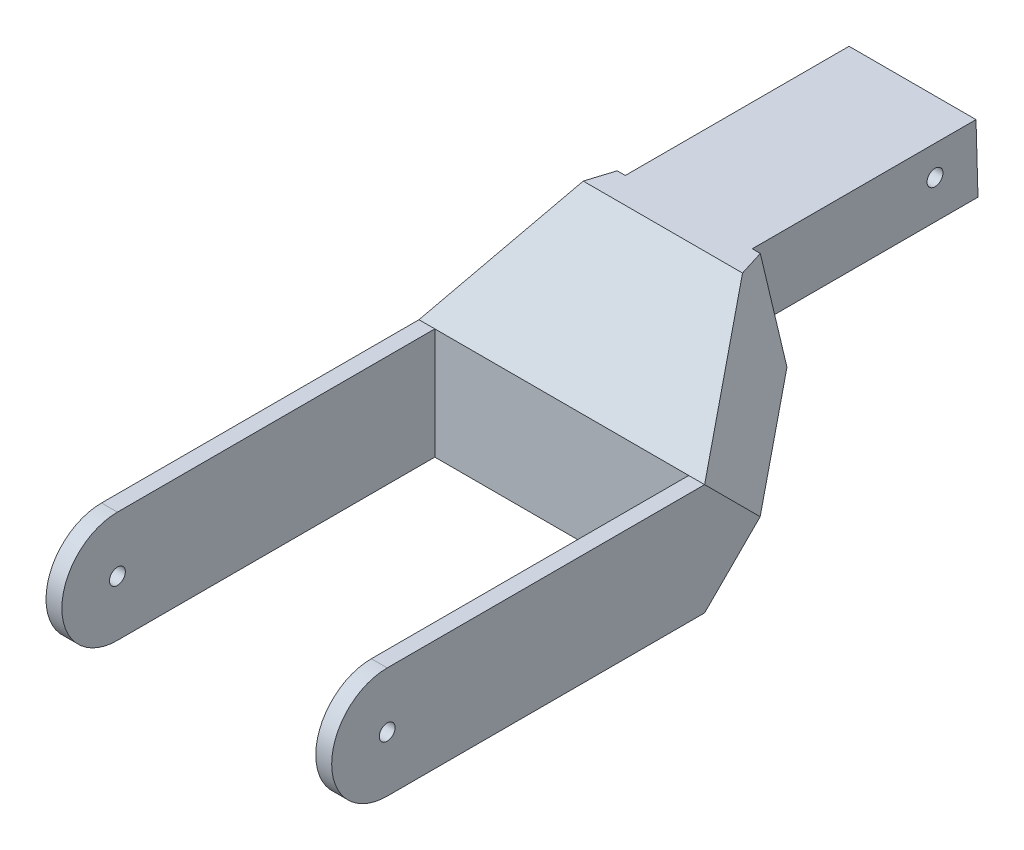
ISO-10303-21;
HEADER;
FILE_DESCRIPTION(('STEP AP214'),'2;1');
FILE_NAME('part.step','',(''),(''),'','','');
FILE_SCHEMA(('AUTOMOTIVE_DESIGN { 1 0 10303 214 1 1 1 1 }'));
ENDSEC;
DATA;
#1=APPLICATION_CONTEXT('core data for automotive mechanical design processes');
#2=APPLICATION_PROTOCOL_DEFINITION('international standard','automotive_design',2000,#1);
#3=PRODUCT_CONTEXT('',#1,'mechanical');
#4=PRODUCT('Part','Part','',(#3));
#5=PRODUCT_RELATED_PRODUCT_CATEGORY('part','',(#4));
#6=PRODUCT_DEFINITION_FORMATION('','',#4);
#7=PRODUCT_DEFINITION_CONTEXT('part definition',#1,'design');
#8=PRODUCT_DEFINITION('design','',#6,#7);
#9=PRODUCT_DEFINITION_SHAPE('','',#8);
#10=(LENGTH_UNIT() NAMED_UNIT(*) SI_UNIT(.MILLI.,.METRE.));
#11=(NAMED_UNIT(*) PLANE_ANGLE_UNIT() SI_UNIT($,.RADIAN.));
#12=(NAMED_UNIT(*) SI_UNIT($,.STERADIAN.) SOLID_ANGLE_UNIT());
#13=UNCERTAINTY_MEASURE_WITH_UNIT(LENGTH_MEASURE(1.E-05),#10,'distance_accuracy_value','');
#14=(GEOMETRIC_REPRESENTATION_CONTEXT(3) GLOBAL_UNCERTAINTY_ASSIGNED_CONTEXT((#13)) GLOBAL_UNIT_ASSIGNED_CONTEXT((#10,
#11,#12)) REPRESENTATION_CONTEXT('',''));
#15=CARTESIAN_POINT('',(0.,0.,0.));
#16=DIRECTION('',(0.,0.,1.));
#17=DIRECTION('',(1.,0.,0.));
#18=AXIS2_PLACEMENT_3D('',#15,#16,#17);
#19=CARTESIAN_POINT('',(9.40909090909091,-14.138051777226,-1.38690316592472));
#20=DIRECTION('',(-1.,0.,0.));
#21=DIRECTION('',(0.,0.,1.));
#22=AXIS2_PLACEMENT_3D('',#19,#20,#21);
#23=PLANE('',#22);
#24=CARTESIAN_POINT('',(9.40909090909091,3.65819158697021,-15.5225961633245));
#25=DIRECTION('',(1.,0.,0.));
#26=DIRECTION('',(0.,0.,-1.));
#27=AXIS2_PLACEMENT_3D('',#24,#25,#26);
#28=CIRCLE('',#27,0.615000000000002);
#29=CARTESIAN_POINT('',(9.40909090909091,3.65819158697021,-16.1375961633245));
#30=VERTEX_POINT('',#29);
#31=EDGE_CURVE('E162',#30,#30,#28,.T.);
#32=ORIENTED_EDGE('',*,*,#31,.F.);
#33=EDGE_LOOP('',(#32));
#34=FACE_BOUND('',#33,.T.);
#35=DIRECTION('',(0.,0.,-1.));
#36=VECTOR('',#35,1.);
#37=CARTESIAN_POINT('',(9.40909090909091,0.679886253093898,0.));
#38=LINE('',#37,#36);
#39=CARTESIAN_POINT('',(9.40909090909091,0.679886253093898,-1.38690316592472));
#40=VERTEX_POINT('',#39);
#41=CARTESIAN_POINT('',(9.40909090909091,0.679886253093898,-18.8456766545249));
#42=VERTEX_POINT('',#41);
#43=EDGE_CURVE('E170',#40,#42,#38,.T.);
#44=ORIENTED_EDGE('',*,*,#43,.T.);
#45=DIRECTION('',(0.,-0.999576101528183,-0.0291138670348016));
#46=VECTOR('',#45,1.);
#47=CARTESIAN_POINT('',(9.40909090909091,9.00223191898086,-18.6032782370719));
#48=LINE('',#47,#46);
#49=CARTESIAN_POINT('',(9.4090909090909,5.95285731368308,-18.6920949731485));
#50=VERTEX_POINT('',#49);
#51=EDGE_CURVE('E58',#50,#42,#48,.T.);
#52=ORIENTED_EDGE('',*,*,#51,.F.);
#53=DIRECTION('',(0.,0.,1.));
#54=VECTOR('',#53,1.);
#55=CARTESIAN_POINT('',(9.40909090909091,5.95285731368307,-1.38690316592472));
#56=LINE('',#55,#54);
#57=CARTESIAN_POINT('',(9.40909090909091,5.95285731368307,-1.38690316592472));
#58=VERTEX_POINT('',#57);
#59=EDGE_CURVE('E167',#50,#58,#56,.T.);
#60=ORIENTED_EDGE('',*,*,#59,.T.);
#61=DIRECTION('',(0.,1.,0.));
#62=VECTOR('',#61,1.);
#63=CARTESIAN_POINT('',(9.40909090909091,-14.138051777226,-1.38690316592472));
#64=LINE('',#63,#62);
#65=EDGE_CURVE('E225',#40,#58,#64,.T.);
#66=ORIENTED_EDGE('',*,*,#65,.F.);
#67=EDGE_LOOP('',(#44,#52,#60,#66));
#68=FACE_BOUND('',#67,.T.);
#69=ADVANCED_FACE('F43',(#34,#68),#23,.F.);
#70=CARTESIAN_POINT('',(-0.409090909090909,-14.138051777226,-1.38690316592472));
#71=DIRECTION('',(1.,0.,0.));
#72=DIRECTION('',(0.,0.,-1.));
#73=AXIS2_PLACEMENT_3D('',#70,#71,#72);
#74=PLANE('',#73);
#75=CARTESIAN_POINT('',(-0.409090909090909,3.65819158697021,-15.5225961633245));
#76=DIRECTION('',(1.,0.,0.));
#77=DIRECTION('',(0.,0.,-1.));
#78=AXIS2_PLACEMENT_3D('',#75,#76,#77);
#79=CIRCLE('',#78,0.615000000000002);
#80=CARTESIAN_POINT('',(-0.409090909090909,3.65819158697021,-16.1375961633245));
#81=VERTEX_POINT('',#80);
#82=EDGE_CURVE('E323',#81,#81,#79,.T.);
#83=ORIENTED_EDGE('',*,*,#82,.T.);
#84=EDGE_LOOP('',(#83));
#85=FACE_BOUND('',#84,.T.);
#86=DIRECTION('',(0.,0.,-1.));
#87=VECTOR('',#86,1.);
#88=CARTESIAN_POINT('',(-0.409090909090909,5.95285731368307,-1.38690316592472));
#89=LINE('',#88,#87);
#90=CARTESIAN_POINT('',(-0.409090909090909,5.95285731368307,-1.38690316592472));
#91=VERTEX_POINT('',#90);
#92=CARTESIAN_POINT('',(-0.409090909090909,5.95285731368307,-18.6920949731485));
#93=VERTEX_POINT('',#92);
#94=EDGE_CURVE('E179',#91,#93,#89,.T.);
#95=ORIENTED_EDGE('',*,*,#94,.T.);
#96=DIRECTION('',(0.,-0.999576101528183,-0.0291138670348016));
#97=VECTOR('',#96,1.);
#98=CARTESIAN_POINT('',(-0.409090909090909,-13.6174148917249,-19.2621029014614));
#99=LINE('',#98,#97);
#100=CARTESIAN_POINT('',(-0.409090909090909,0.679886253093898,-18.8456766545249));
#101=VERTEX_POINT('',#100);
#102=EDGE_CURVE('E157',#93,#101,#99,.T.);
#103=ORIENTED_EDGE('',*,*,#102,.T.);
#104=DIRECTION('',(0.,0.,-1.));
#105=VECTOR('',#104,1.);
#106=CARTESIAN_POINT('',(-0.409090909090909,0.679886253093898,-1.38690316592472));
#107=LINE('',#106,#105);
#108=CARTESIAN_POINT('',(-0.409090909090909,0.679886253093898,-1.38690316592472));
#109=VERTEX_POINT('',#108);
#110=EDGE_CURVE('E340',#109,#101,#107,.T.);
#111=ORIENTED_EDGE('',*,*,#110,.F.);
#112=DIRECTION('',(0.,1.,0.));
#113=VECTOR('',#112,1.);
#114=CARTESIAN_POINT('',(-0.409090909090909,-14.138051777226,-1.38690316592472));
#115=LINE('',#114,#113);
#116=EDGE_CURVE('E222',#109,#91,#115,.T.);
#117=ORIENTED_EDGE('',*,*,#116,.T.);
#118=EDGE_LOOP('',(#95,#103,#111,#117));
#119=FACE_BOUND('',#118,.T.);
#120=ADVANCED_FACE('F424',(#85,#119),#74,.F.);
#121=CARTESIAN_POINT('',(89.5007298673265,-1.86532450449874,32.9767331977116));
#122=DIRECTION('',(0.,1.,0.));
#123=DIRECTION('',(0.,0.,1.));
#124=AXIS2_PLACEMENT_3D('',#121,#122,#123);
#125=PLANE('',#124);
#126=DIRECTION('',(0.,0.,1.));
#127=VECTOR('',#126,1.);
#128=CARTESIAN_POINT('',(-5.31818181818182,-1.86532450449874,40.340369561348));
#129=LINE('',#128,#127);
#130=CARTESIAN_POINT('',(-5.31818181818182,-1.86532450449874,8.4312786522571));
#131=VERTEX_POINT('',#130);
#132=CARTESIAN_POINT('',(-5.31818181818182,-1.86532450449874,32.9767331977116));
#133=VERTEX_POINT('',#132);
#134=EDGE_CURVE('E228',#131,#133,#129,.T.);
#135=ORIENTED_EDGE('',*,*,#134,.F.);
#136=DIRECTION('',(-1.,0.,0.));
#137=VECTOR('',#136,1.);
#138=CARTESIAN_POINT('',(89.5007298673265,-1.86532450449874,8.4312786522571));
#139=LINE('',#138,#137);
#140=CARTESIAN_POINT('',(-6.54545454545454,-1.86532450449874,8.4312786522571));
#141=VERTEX_POINT('',#140);
#142=EDGE_CURVE('E273',#131,#141,#139,.T.);
#143=ORIENTED_EDGE('',*,*,#142,.T.);
#144=DIRECTION('',(0.,0.,1.));
#145=VECTOR('',#144,1.);
#146=CARTESIAN_POINT('',(-6.54545454545454,-1.86532450449874,32.9767331977116));
#147=LINE('',#146,#145);
#148=CARTESIAN_POINT('',(-6.54545454545454,-1.86532450449874,32.9767331977116));
#149=VERTEX_POINT('',#148);
#150=EDGE_CURVE('E261',#141,#149,#147,.T.);
#151=ORIENTED_EDGE('',*,*,#150,.T.);
#152=DIRECTION('',(-1.,0.,0.));
#153=VECTOR('',#152,1.);
#154=CARTESIAN_POINT('',(89.5007298673265,-1.86532450449874,32.9767331977116));
#155=LINE('',#154,#153);
#156=EDGE_CURVE('E265',#133,#149,#155,.T.);
#157=ORIENTED_EDGE('',*,*,#156,.F.);
#158=EDGE_LOOP('',(#135,#143,#151,#157));
#159=FACE_BOUND('',#158,.T.);
#160=ADVANCED_FACE('F371',(#159),#125,.T.);
#161=CARTESIAN_POINT('',(15.5454545454545,-10.4562339328957,-16.1141758931975));
#162=DIRECTION('',(0.,1.,0.));
#163=DIRECTION('',(0.,0.,1.));
#164=AXIS2_PLACEMENT_3D('',#161,#162,#163);
#165=PLANE('',#164);
#166=DIRECTION('',(1.,0.,0.));
#167=VECTOR('',#166,1.);
#168=CARTESIAN_POINT('',(-6.54545454545454,-10.4562339328957,8.43127865225709));
#169=LINE('',#168,#167);
#170=CARTESIAN_POINT('',(-6.54545454545454,-10.4562339328957,8.43127865225709));
#171=VERTEX_POINT('',#170);
#172=CARTESIAN_POINT('',(-5.31818181818182,-10.4562339328957,8.4312786522571));
#173=VERTEX_POINT('',#172);
#174=EDGE_CURVE('E287',#171,#173,#169,.T.);
#175=ORIENTED_EDGE('',*,*,#174,.T.);
#176=DIRECTION('',(0.,0.,1.));
#177=VECTOR('',#176,1.);
#178=CARTESIAN_POINT('',(-5.31818181818182,-10.4562339328957,-16.1141758931975));
#179=LINE('',#178,#177);
#180=CARTESIAN_POINT('',(-5.31818181818182,-10.4562339328957,32.9767331977116));
#181=VERTEX_POINT('',#180);
#182=EDGE_CURVE('E249',#173,#181,#179,.T.);
#183=ORIENTED_EDGE('',*,*,#182,.T.);
#184=DIRECTION('',(-1.,0.,0.));
#185=VECTOR('',#184,1.);
#186=CARTESIAN_POINT('',(15.5454545454545,-10.4562339328957,32.9767331977116));
#187=LINE('',#186,#185);
#188=CARTESIAN_POINT('',(-6.54545454545454,-10.4562339328957,32.9767331977116));
#189=VERTEX_POINT('',#188);
#190=EDGE_CURVE('E301',#181,#189,#187,.T.);
#191=ORIENTED_EDGE('',*,*,#190,.T.);
#192=DIRECTION('',(0.,0.,-1.));
#193=VECTOR('',#192,1.);
#194=CARTESIAN_POINT('',(-6.54545454545454,-10.4562339328957,-16.1141758931975));
#195=LINE('',#194,#193);
#196=EDGE_CURVE('E291',#189,#171,#195,.T.);
#197=ORIENTED_EDGE('',*,*,#196,.T.);
#198=EDGE_LOOP('',(#175,#183,#191,#197));
#199=FACE_BOUND('',#198,.T.);
#200=ADVANCED_FACE('F388',(#199),#165,.F.);
#201=CARTESIAN_POINT('',(-6.54545454545454,-6.16077921869722,32.9767331977116));
#202=DIRECTION('',(1.,0.,0.));
#203=DIRECTION('',(0.,0.,-1.));
#204=AXIS2_PLACEMENT_3D('',#201,#202,#203);
#205=CYLINDRICAL_SURFACE('',#204,4.29545471419847);
#206=CARTESIAN_POINT('',(-5.31818181818182,-6.16077921869722,32.9767331977116));
#207=DIRECTION('',(-1.,0.,0.));
#208=DIRECTION('',(0.,0.,1.));
#209=AXIS2_PLACEMENT_3D('',#206,#207,#208);
#210=CIRCLE('',#209,4.29545471419847);
#211=EDGE_CURVE('E312',#133,#181,#210,.F.);
#212=ORIENTED_EDGE('',*,*,#211,.F.);
#213=ORIENTED_EDGE('',*,*,#156,.T.);
#214=CARTESIAN_POINT('',(-6.54545454545454,-6.16077921869722,32.9767331977116));
#215=DIRECTION('',(1.,0.,0.));
#216=DIRECTION('',(0.,0.,-1.));
#217=AXIS2_PLACEMENT_3D('',#214,#215,#216);
#218=CIRCLE('',#217,4.29545471419847);
#219=EDGE_CURVE('E254',#149,#189,#218,.T.);
#220=ORIENTED_EDGE('',*,*,#219,.T.);
#221=ORIENTED_EDGE('',*,*,#190,.F.);
#222=EDGE_LOOP('',(#212,#213,#220,#221));
#223=FACE_BOUND('',#222,.T.);
#224=ADVANCED_FACE('F382',(#223),#205,.T.);
#225=CARTESIAN_POINT('',(89.5007298673265,-1.86532450449874,8.4312786522571));
#226=DIRECTION('',(0.,0.707106781186548,0.707106781186548));
#227=DIRECTION('',(0.,-0.707106781186548,0.707106781186548));
#228=AXIS2_PLACEMENT_3D('',#225,#226,#227);
#229=PLANE('',#228);
#230=DIRECTION('',(1.,0.,0.));
#231=VECTOR('',#230,1.);
#232=CARTESIAN_POINT('',(89.5007298673265,5.95285731368309,0.613096834075266));
#233=LINE('',#232,#231);
#234=CARTESIAN_POINT('',(-1.65909090909091,5.95285731368307,0.613096834075279));
#235=VERTEX_POINT('',#234);
#236=CARTESIAN_POINT('',(10.6590909090909,5.95285731368308,0.613096834075275));
#237=VERTEX_POINT('',#236);
#238=EDGE_CURVE('E66',#235,#237,#233,.T.);
#239=ORIENTED_EDGE('',*,*,#238,.F.);
#240=DIRECTION('',(0.404226041727222,0.646761666763555,-0.646761666763555));
#241=VECTOR('',#240,1.);
#242=CARTESIAN_POINT('',(-0.409090909090909,7.95285731368308,-1.38690316592472));
#243=LINE('',#242,#241);
#244=EDGE_CURVE('E212',#141,#235,#243,.T.);
#245=ORIENTED_EDGE('',*,*,#244,.F.);
#246=ORIENTED_EDGE('',*,*,#142,.F.);
#247=DIRECTION('',(-1.,0.,0.));
#248=VECTOR('',#247,1.);
#249=CARTESIAN_POINT('',(14.3181818181818,-1.86532450449874,8.4312786522571));
#250=LINE('',#249,#248);
#251=CARTESIAN_POINT('',(14.3181818181818,-1.86532450449874,8.4312786522571));
#252=VERTEX_POINT('',#251);
#253=EDGE_CURVE('E235',#252,#131,#250,.T.);
#254=ORIENTED_EDGE('',*,*,#253,.F.);
#255=CARTESIAN_POINT('',(15.5454545454546,-1.86532450449874,8.4312786522571));
#256=VERTEX_POINT('',#255);
#257=EDGE_CURVE('E274',#256,#252,#139,.T.);
#258=ORIENTED_EDGE('',*,*,#257,.F.);
#259=DIRECTION('',(0.404226041727222,-0.646761666763555,0.646761666763555));
#260=VECTOR('',#259,1.);
#261=CARTESIAN_POINT('',(9.40909090909091,7.95285731368308,-1.38690316592472));
#262=LINE('',#261,#260);
#263=EDGE_CURVE('E198',#237,#256,#262,.T.);
#264=ORIENTED_EDGE('',*,*,#263,.F.);
#265=EDGE_LOOP('',(#239,#245,#246,#254,#258,#264));
#266=FACE_BOUND('',#265,.T.);
#267=ADVANCED_FACE('F365',(#266),#229,.T.);
#268=DIRECTION('',(0.,0.,-1.));
#269=VECTOR('',#268,1.);
#270=CARTESIAN_POINT('',(14.3181818181818,-1.86532450449874,40.340369561348));
#271=LINE('',#270,#269);
#272=CARTESIAN_POINT('',(14.3181818181818,-1.86532450449874,32.9767331977116));
#273=VERTEX_POINT('',#272);
#274=EDGE_CURVE('E231',#273,#252,#271,.T.);
#275=ORIENTED_EDGE('',*,*,#274,.F.);
#276=CARTESIAN_POINT('',(15.5454545454545,-1.86532450449874,32.9767331977116));
#277=VERTEX_POINT('',#276);
#278=EDGE_CURVE('E269',#277,#273,#155,.T.);
#279=ORIENTED_EDGE('',*,*,#278,.F.);
#280=DIRECTION('',(0.,0.,1.));
#281=VECTOR('',#280,1.);
#282=CARTESIAN_POINT('',(15.5454545454546,-1.86532450449874,32.9767331977116));
#283=LINE('',#282,#281);
#284=EDGE_CURVE('E258',#256,#277,#283,.T.);
#285=ORIENTED_EDGE('',*,*,#284,.F.);
#286=ORIENTED_EDGE('',*,*,#257,.T.);
#287=EDGE_LOOP('',(#275,#279,#285,#286));
#288=FACE_BOUND('',#287,.T.);
#289=ADVANCED_FACE('F413',(#288),#125,.T.);
#290=CARTESIAN_POINT('',(15.5454545454545,-10.4562339328957,32.9767331977116));
#291=VERTEX_POINT('',#290);
#292=CARTESIAN_POINT('',(14.3181818181818,-10.4562339328957,32.9767331977116));
#293=VERTEX_POINT('',#292);
#294=EDGE_CURVE('E305',#291,#293,#187,.T.);
#295=ORIENTED_EDGE('',*,*,#294,.T.);
#296=DIRECTION('',(0.,0.,-1.));
#297=VECTOR('',#296,1.);
#298=CARTESIAN_POINT('',(14.3181818181818,-10.4562339328957,-16.1141758931975));
#299=LINE('',#298,#297);
#300=CARTESIAN_POINT('',(14.3181818181818,-10.4562339328957,8.4312786522571));
#301=VERTEX_POINT('',#300);
#302=EDGE_CURVE('E243',#293,#301,#299,.T.);
#303=ORIENTED_EDGE('',*,*,#302,.T.);
#304=CARTESIAN_POINT('',(15.5454545454545,-10.4562339328957,8.43127865225709));
#305=VERTEX_POINT('',#304);
#306=EDGE_CURVE('E293',#301,#305,#169,.T.);
#307=ORIENTED_EDGE('',*,*,#306,.T.);
#308=DIRECTION('',(0.,0.,-1.));
#309=VECTOR('',#308,1.);
#310=CARTESIAN_POINT('',(15.5454545454545,-10.4562339328957,-16.1141758931975));
#311=LINE('',#310,#309);
#312=EDGE_CURVE('E297',#291,#305,#311,.T.);
#313=ORIENTED_EDGE('',*,*,#312,.F.);
#314=EDGE_LOOP('',(#295,#303,#307,#313));
#315=FACE_BOUND('',#314,.T.);
#316=ADVANCED_FACE('F45',(#315),#165,.F.);
#317=CARTESIAN_POINT('',(15.5454545454545,0.368549145359997,-1.29982685252481));
#318=DIRECTION('',(-1.,0.,0.));
#319=DIRECTION('',(0.,0.,1.));
#320=AXIS2_PLACEMENT_3D('',#317,#318,#319);
#321=PLANE('',#320);
#322=CARTESIAN_POINT('',(15.5454545454546,-6.16077921869722,32.9767331977116));
#323=DIRECTION('',(-1.,0.,0.));
#324=DIRECTION('',(0.,0.,1.));
#325=AXIS2_PLACEMENT_3D('',#322,#323,#324);
#326=CIRCLE('',#325,0.613636363636363);
#327=CARTESIAN_POINT('',(15.5454545454546,-6.16077921869722,33.590369561348));
#328=VERTEX_POINT('',#327);
#329=EDGE_CURVE('E184',#328,#328,#326,.T.);
#330=ORIENTED_EDGE('',*,*,#329,.T.);
#331=EDGE_LOOP('',(#330));
#332=FACE_BOUND('',#331,.T.);
#333=DIRECTION('',(0.,0.707106781186548,-0.707106781186548));
#334=VECTOR('',#333,1.);
#335=CARTESIAN_POINT('',(15.5454545454545,-0.178289641376894,-1.8466656392617));
#336=LINE('',#335,#334);
#337=CARTESIAN_POINT('',(15.5454545454546,-6.16077921869722,4.13582393805863));
#338=VERTEX_POINT('',#337);
#339=EDGE_CURVE('E278',#305,#338,#336,.T.);
#340=ORIENTED_EDGE('',*,*,#339,.T.);
#341=DIRECTION('',(0.,0.707106781186548,0.707106781186547));
#342=VECTOR('',#341,1.);
#343=CARTESIAN_POINT('',(15.5454545454546,-17.4859561252561,-7.18935296850026));
#344=LINE('',#343,#342);
#345=EDGE_CURVE('E201',#338,#256,#344,.T.);
#346=ORIENTED_EDGE('',*,*,#345,.T.);
#347=ORIENTED_EDGE('',*,*,#284,.T.);
#348=CARTESIAN_POINT('',(15.5454545454545,-6.16077921869722,32.9767331977116));
#349=DIRECTION('',(1.,0.,0.));
#350=DIRECTION('',(0.,0.,-1.));
#351=AXIS2_PLACEMENT_3D('',#348,#349,#350);
#352=CIRCLE('',#351,4.29545471419847);
#353=EDGE_CURVE('E253',#277,#291,#352,.T.);
#354=ORIENTED_EDGE('',*,*,#353,.T.);
#355=ORIENTED_EDGE('',*,*,#312,.T.);
#356=EDGE_LOOP('',(#340,#346,#347,#354,#355));
#357=FACE_BOUND('',#356,.T.);
#358=ADVANCED_FACE('F416',(#332,#357),#321,.F.);
#359=CARTESIAN_POINT('',(-6.54545454545454,0.368549145359997,-1.29982685252481));
#360=DIRECTION('',(-1.,0.,0.));
#361=DIRECTION('',(0.,0.,1.));
#362=AXIS2_PLACEMENT_3D('',#359,#360,#361);
#363=PLANE('',#362);
#364=CARTESIAN_POINT('',(-6.54545454545454,-6.16077921869722,32.9767331977116));
#365=DIRECTION('',(-1.,0.,0.));
#366=DIRECTION('',(0.,0.,1.));
#367=AXIS2_PLACEMENT_3D('',#364,#365,#366);
#368=CIRCLE('',#367,0.613636363636363);
#369=CARTESIAN_POINT('',(-6.54545454545454,-6.16077921869722,33.590369561348));
#370=VERTEX_POINT('',#369);
#371=EDGE_CURVE('E178',#370,#370,#368,.T.);
#372=ORIENTED_EDGE('',*,*,#371,.F.);
#373=EDGE_LOOP('',(#372));
#374=FACE_BOUND('',#373,.T.);
#375=DIRECTION('',(0.,0.707106781186548,0.707106781186547));
#376=VECTOR('',#375,1.);
#377=CARTESIAN_POINT('',(-6.54545454545454,-17.4859561252561,-7.18935296850027));
#378=LINE('',#377,#376);
#379=CARTESIAN_POINT('',(-6.54545454545454,-6.16077921869722,4.13582393805863));
#380=VERTEX_POINT('',#379);
#381=EDGE_CURVE('E216',#380,#141,#378,.T.);
#382=ORIENTED_EDGE('',*,*,#381,.F.);
#383=DIRECTION('',(0.,0.707106781186548,-0.707106781186548));
#384=VECTOR('',#383,1.);
#385=CARTESIAN_POINT('',(-6.54545454545454,-0.178289641376894,-1.8466656392617));
#386=LINE('',#385,#384);
#387=EDGE_CURVE('E279',#171,#380,#386,.T.);
#388=ORIENTED_EDGE('',*,*,#387,.F.);
#389=ORIENTED_EDGE('',*,*,#196,.F.);
#390=ORIENTED_EDGE('',*,*,#219,.F.);
#391=ORIENTED_EDGE('',*,*,#150,.F.);
#392=EDGE_LOOP('',(#382,#388,#389,#390,#391));
#393=FACE_BOUND('',#392,.T.);
#394=ADVANCED_FACE('F376',(#374,#393),#363,.T.);
#395=CARTESIAN_POINT('',(-6.54545454545454,-0.178289641376894,-1.8466656392617));
#396=DIRECTION('',(0.,-0.707106781186547,-0.707106781186547));
#397=DIRECTION('',(0.,0.707106781186548,-0.707106781186548));
#398=AXIS2_PLACEMENT_3D('',#395,#396,#397);
#399=PLANE('',#398);
#400=DIRECTION('',(-0.404226041727222,0.646761666763555,-0.646761666763555));
#401=VECTOR('',#400,1.);
#402=CARTESIAN_POINT('',(8.8077297516091,4.6195804514555,-6.64453573209409));
#403=LINE('',#402,#401);
#404=CARTESIAN_POINT('',(12.093750105465,-0.63805211471387,-1.38690316592472));
#405=VERTEX_POINT('',#404);
#406=EDGE_CURVE('E208',#338,#405,#403,.T.);
#407=ORIENTED_EDGE('',*,*,#406,.F.);
#408=ORIENTED_EDGE('',*,*,#339,.F.);
#409=ORIENTED_EDGE('',*,*,#306,.F.);
#410=EDGE_CURVE('E292',#173,#301,#169,.T.);
#411=ORIENTED_EDGE('',*,*,#410,.F.);
#412=ORIENTED_EDGE('',*,*,#174,.F.);
#413=ORIENTED_EDGE('',*,*,#387,.T.);
#414=DIRECTION('',(-0.404226041727222,-0.646761666763555,0.646761666763555));
#415=VECTOR('',#414,1.);
#416=CARTESIAN_POINT('',(-3.4173554200583,-1.15582061806322,-0.86913466257537));
#417=LINE('',#416,#415);
#418=CARTESIAN_POINT('',(-3.09375010546496,-0.638052114713872,-1.38690316592472));
#419=VERTEX_POINT('',#418);
#420=EDGE_CURVE('E219',#419,#380,#417,.T.);
#421=ORIENTED_EDGE('',*,*,#420,.F.);
#422=DIRECTION('',(1.,0.,0.));
#423=VECTOR('',#422,1.);
#424=CARTESIAN_POINT('',(-6.54545454545454,-0.638052114713868,-1.38690316592472));
#425=LINE('',#424,#423);
#426=EDGE_CURVE('E283',#419,#405,#425,.T.);
#427=ORIENTED_EDGE('',*,*,#426,.T.);
#428=EDGE_LOOP('',(#407,#408,#409,#411,#412,#413,#421,#427));
#429=FACE_BOUND('',#428,.T.);
#430=ADVANCED_FACE('F399',(#429),#399,.T.);
#431=CARTESIAN_POINT('',(14.3181818181818,-6.16077921869722,32.9767331977116));
#432=DIRECTION('',(1.,0.,0.));
#433=DIRECTION('',(0.,0.,-1.));
#434=AXIS2_PLACEMENT_3D('',#431,#432,#433);
#435=CIRCLE('',#434,4.29545471419847);
#436=EDGE_CURVE('E309',#293,#273,#435,.F.);
#437=ORIENTED_EDGE('',*,*,#436,.F.);
#438=ORIENTED_EDGE('',*,*,#294,.F.);
#439=ORIENTED_EDGE('',*,*,#353,.F.);
#440=ORIENTED_EDGE('',*,*,#278,.T.);
#441=EDGE_LOOP('',(#437,#438,#439,#440));
#442=FACE_BOUND('',#441,.T.);
#443=ADVANCED_FACE('F409',(#442),#205,.T.);
#444=CARTESIAN_POINT('',(-5.31818181818182,-23.9562335954078,40.340369561348));
#445=DIRECTION('',(-1.,0.,0.));
#446=DIRECTION('',(0.,0.,1.));
#447=AXIS2_PLACEMENT_3D('',#444,#445,#446);
#448=PLANE('',#447);
#449=CARTESIAN_POINT('',(-5.31818181818182,-6.16077921869722,32.9767331977116));
#450=DIRECTION('',(-1.,0.,0.));
#451=DIRECTION('',(0.,0.,1.));
#452=AXIS2_PLACEMENT_3D('',#449,#450,#451);
#453=CIRCLE('',#452,0.613636363636363);
#454=CARTESIAN_POINT('',(-5.31818181818182,-6.16077921869722,33.590369561348));
#455=VERTEX_POINT('',#454);
#456=EDGE_CURVE('E194',#455,#455,#453,.T.);
#457=ORIENTED_EDGE('',*,*,#456,.T.);
#458=EDGE_LOOP('',(#457));
#459=FACE_BOUND('',#458,.T.);
#460=DIRECTION('',(0.,1.,0.));
#461=VECTOR('',#460,1.);
#462=CARTESIAN_POINT('',(-5.31818181818182,-23.9562335954078,8.4312786522571));
#463=LINE('',#462,#461);
#464=EDGE_CURVE('E240',#173,#131,#463,.T.);
#465=ORIENTED_EDGE('',*,*,#464,.T.);
#466=ORIENTED_EDGE('',*,*,#134,.T.);
#467=ORIENTED_EDGE('',*,*,#211,.T.);
#468=ORIENTED_EDGE('',*,*,#182,.F.);
#469=EDGE_LOOP('',(#465,#466,#467,#468));
#470=FACE_BOUND('',#469,.T.);
#471=ADVANCED_FACE('F391',(#459,#470),#448,.F.);
#472=CARTESIAN_POINT('',(14.3181818181818,-23.9562335954078,40.340369561348));
#473=DIRECTION('',(1.,0.,0.));
#474=DIRECTION('',(0.,0.,-1.));
#475=AXIS2_PLACEMENT_3D('',#472,#473,#474);
#476=PLANE('',#475);
#477=CARTESIAN_POINT('',(14.3181818181818,-6.16077921869722,32.9767331977116));
#478=DIRECTION('',(1.,0.,0.));
#479=DIRECTION('',(0.,0.,-1.));
#480=AXIS2_PLACEMENT_3D('',#477,#478,#479);
#481=CIRCLE('',#480,0.613636363636363);
#482=CARTESIAN_POINT('',(14.3181818181818,-6.16077921869722,32.3630968340753));
#483=VERTEX_POINT('',#482);
#484=EDGE_CURVE('E192',#483,#483,#481,.T.);
#485=ORIENTED_EDGE('',*,*,#484,.T.);
#486=EDGE_LOOP('',(#485));
#487=FACE_BOUND('',#486,.T.);
#488=ORIENTED_EDGE('',*,*,#436,.T.);
#489=ORIENTED_EDGE('',*,*,#274,.T.);
#490=DIRECTION('',(0.,1.,0.));
#491=VECTOR('',#490,1.);
#492=CARTESIAN_POINT('',(14.3181818181818,-23.9562335954078,8.4312786522571));
#493=LINE('',#492,#491);
#494=EDGE_CURVE('E239',#301,#252,#493,.T.);
#495=ORIENTED_EDGE('',*,*,#494,.F.);
#496=ORIENTED_EDGE('',*,*,#302,.F.);
#497=EDGE_LOOP('',(#488,#489,#495,#496));
#498=FACE_BOUND('',#497,.T.);
#499=ADVANCED_FACE('F406',(#487,#498),#476,.F.);
#500=CARTESIAN_POINT('',(14.3181818181818,-23.9562335954078,8.4312786522571));
#501=DIRECTION('',(0.,0.,-1.));
#502=DIRECTION('',(-1.,0.,0.));
#503=AXIS2_PLACEMENT_3D('',#500,#501,#502);
#504=PLANE('',#503);
#505=ORIENTED_EDGE('',*,*,#410,.T.);
#506=ORIENTED_EDGE('',*,*,#494,.T.);
#507=ORIENTED_EDGE('',*,*,#253,.T.);
#508=ORIENTED_EDGE('',*,*,#464,.F.);
#509=EDGE_LOOP('',(#505,#506,#507,#508));
#510=FACE_BOUND('',#509,.T.);
#511=ADVANCED_FACE('F394',(#510),#504,.F.);
#512=CARTESIAN_POINT('',(9.40909090909091,-14.138051777226,-1.38690316592472));
#513=DIRECTION('',(0.,0.,1.));
#514=DIRECTION('',(1.,0.,0.));
#515=AXIS2_PLACEMENT_3D('',#512,#513,#514);
#516=PLANE('',#515);
#517=ORIENTED_EDGE('',*,*,#426,.F.);
#518=DIRECTION('',(0.298274993135947,0.95447997803503,0.));
#519=VECTOR('',#518,1.);
#520=CARTESIAN_POINT('',(-6.69831769653834,-12.1726684061487,-1.38690316592472));
#521=LINE('',#520,#519);
#522=CARTESIAN_POINT('',(-1.03409090909091,5.95285731368307,-1.38690316592472));
#523=VERTEX_POINT('',#522);
#524=EDGE_CURVE('E315',#419,#523,#521,.T.);
#525=ORIENTED_EDGE('',*,*,#524,.T.);
#526=DIRECTION('',(1.,0.,0.));
#527=VECTOR('',#526,1.);
#528=CARTESIAN_POINT('',(-0.409090909090911,5.95285731368307,-1.38690316592472));
#529=LINE('',#528,#527);
#530=EDGE_CURVE('E186',#523,#91,#529,.T.);
#531=ORIENTED_EDGE('',*,*,#530,.T.);
#532=ORIENTED_EDGE('',*,*,#116,.F.);
#533=DIRECTION('',(1.,0.,0.));
#534=VECTOR('',#533,1.);
#535=CARTESIAN_POINT('',(-0.590909090909093,0.679886253093898,-1.38690316592472));
#536=LINE('',#535,#534);
#537=EDGE_CURVE('E330',#109,#40,#536,.T.);
#538=ORIENTED_EDGE('',*,*,#537,.T.);
#539=ORIENTED_EDGE('',*,*,#65,.T.);
#540=DIRECTION('',(1.,0.,0.));
#541=VECTOR('',#540,1.);
#542=CARTESIAN_POINT('',(9.4090909090909,5.95285731368307,-1.38690316592472));
#543=LINE('',#542,#541);
#544=CARTESIAN_POINT('',(10.0340909090909,5.95285731368308,-1.38690316592472));
#545=VERTEX_POINT('',#544);
#546=EDGE_CURVE('E176',#58,#545,#543,.T.);
#547=ORIENTED_EDGE('',*,*,#546,.T.);
#548=DIRECTION('',(0.298274993135947,-0.95447997803503,0.));
#549=VECTOR('',#548,1.);
#550=CARTESIAN_POINT('',(15.6983176965383,-12.1726684061487,-1.38690316592472));
#551=LINE('',#550,#549);
#552=EDGE_CURVE('E205',#545,#405,#551,.T.);
#553=ORIENTED_EDGE('',*,*,#552,.T.);
#554=EDGE_LOOP('',(#517,#525,#531,#532,#538,#539,#547,#553));
#555=FACE_BOUND('',#554,.T.);
#556=ADVANCED_FACE('F355',(#555),#516,.F.);
#557=CARTESIAN_POINT('',(-0.409090909090909,-7.66777430707429,-17.0075347866821));
#558=DIRECTION('',(0.914659120760047,-0.285830975237515,0.285830975237515));
#559=DIRECTION('',(0.298274993135947,0.,-0.95447997803503));
#560=AXIS2_PLACEMENT_3D('',#557,#558,#559);
#561=PLANE('',#560);
#562=ORIENTED_EDGE('',*,*,#244,.T.);
#563=DIRECTION('',(0.298274993135947,0.,-0.95447997803503));
#564=VECTOR('',#563,1.);
#565=CARTESIAN_POINT('',(3.46866898293966,5.95285731368307,-15.7957348204225));
#566=LINE('',#565,#564);
#567=EDGE_CURVE('E348',#235,#523,#566,.T.);
#568=ORIENTED_EDGE('',*,*,#567,.T.);
#569=ORIENTED_EDGE('',*,*,#524,.F.);
#570=ORIENTED_EDGE('',*,*,#420,.T.);
#571=ORIENTED_EDGE('',*,*,#381,.T.);
#572=EDGE_LOOP('',(#562,#568,#569,#570,#571));
#573=FACE_BOUND('',#572,.T.);
#574=ADVANCED_FACE('F358',(#573),#561,.F.);
#575=CARTESIAN_POINT('',(9.40909090909091,-7.66777430707429,-17.0075347866821));
#576=DIRECTION('',(-0.914659120760047,-0.285830975237515,0.285830975237515));
#577=DIRECTION('',(0.298274993135947,0.,0.95447997803503));
#578=AXIS2_PLACEMENT_3D('',#575,#576,#577);
#579=PLANE('',#578);
#580=ORIENTED_EDGE('',*,*,#552,.F.);
#581=DIRECTION('',(0.298274993135947,0.,0.95447997803503));
#582=VECTOR('',#581,1.);
#583=CARTESIAN_POINT('',(5.53133101706034,5.95285731368308,-15.7957348204225));
#584=LINE('',#583,#582);
#585=EDGE_CURVE('E52',#545,#237,#584,.T.);
#586=ORIENTED_EDGE('',*,*,#585,.T.);
#587=ORIENTED_EDGE('',*,*,#263,.T.);
#588=ORIENTED_EDGE('',*,*,#345,.F.);
#589=ORIENTED_EDGE('',*,*,#406,.T.);
#590=EDGE_LOOP('',(#580,#586,#587,#588,#589));
#591=FACE_BOUND('',#590,.T.);
#592=ADVANCED_FACE('F419',(#591),#579,.F.);
#593=CARTESIAN_POINT('',(15.5454545454546,-6.16077921869722,32.9767331977116));
#594=DIRECTION('',(-1.,0.,0.));
#595=DIRECTION('',(0.,0.,1.));
#596=AXIS2_PLACEMENT_3D('',#593,#594,#595);
#597=CYLINDRICAL_SURFACE('',#596,0.613636363636363);
#598=ORIENTED_EDGE('',*,*,#329,.F.);
#599=EDGE_LOOP('',(#598));
#600=FACE_BOUND('',#599,.T.);
#601=ORIENTED_EDGE('',*,*,#484,.F.);
#602=EDGE_LOOP('',(#601));
#603=FACE_BOUND('',#602,.T.);
#604=ADVANCED_FACE('F466',(#600,#603),#597,.F.);
#605=ORIENTED_EDGE('',*,*,#371,.T.);
#606=EDGE_LOOP('',(#605));
#607=FACE_BOUND('',#606,.T.);
#608=ORIENTED_EDGE('',*,*,#456,.F.);
#609=EDGE_LOOP('',(#608));
#610=FACE_BOUND('',#609,.T.);
#611=ADVANCED_FACE('F463',(#607,#610),#597,.F.);
#612=CARTESIAN_POINT('',(14.1471752229063,5.95285731368308,-20.409630438652));
#613=DIRECTION('',(0.,-1.,0.));
#614=DIRECTION('',(1.,0.,0.));
#615=AXIS2_PLACEMENT_3D('',#612,#613,#614);
#616=PLANE('',#615);
#617=ORIENTED_EDGE('',*,*,#59,.F.);
#618=DIRECTION('',(-1.,0.,0.));
#619=VECTOR('',#618,1.);
#620=CARTESIAN_POINT('',(14.1471752229063,5.95285731368308,-18.6920949731485));
#621=LINE('',#620,#619);
#622=EDGE_CURVE('E154',#50,#93,#621,.T.);
#623=ORIENTED_EDGE('',*,*,#622,.T.);
#624=ORIENTED_EDGE('',*,*,#94,.F.);
#625=ORIENTED_EDGE('',*,*,#530,.F.);
#626=ORIENTED_EDGE('',*,*,#567,.F.);
#627=ORIENTED_EDGE('',*,*,#238,.T.);
#628=ORIENTED_EDGE('',*,*,#585,.F.);
#629=ORIENTED_EDGE('',*,*,#546,.F.);
#630=EDGE_LOOP('',(#617,#623,#624,#625,#626,#627,#628,#629));
#631=FACE_BOUND('',#630,.T.);
#632=ADVANCED_FACE('F174',(#631),#616,.F.);
#633=CARTESIAN_POINT('',(-0.590909090909093,0.679886253093898,0.));
#634=DIRECTION('',(0.,-1.,0.));
#635=DIRECTION('',(0.,0.,-1.));
#636=AXIS2_PLACEMENT_3D('',#633,#634,#635);
#637=PLANE('',#636);
#638=DIRECTION('',(-1.,0.,0.));
#639=VECTOR('',#638,1.);
#640=CARTESIAN_POINT('',(-0.590909090909093,0.679886253093898,-18.8456766545249));
#641=LINE('',#640,#639);
#642=EDGE_CURVE('E11',#42,#101,#641,.T.);
#643=ORIENTED_EDGE('',*,*,#642,.F.);
#644=ORIENTED_EDGE('',*,*,#43,.F.);
#645=ORIENTED_EDGE('',*,*,#537,.F.);
#646=ORIENTED_EDGE('',*,*,#110,.T.);
#647=EDGE_LOOP('',(#643,#644,#645,#646));
#648=FACE_BOUND('',#647,.T.);
#649=ADVANCED_FACE('F422',(#648),#637,.T.);
#650=CARTESIAN_POINT('',(-0.590909090909093,3.65819158697021,-15.5225961633245));
#651=DIRECTION('',(1.,0.,0.));
#652=DIRECTION('',(0.,0.,-1.));
#653=AXIS2_PLACEMENT_3D('',#650,#651,#652);
#654=CYLINDRICAL_SURFACE('',#653,0.615000000000002);
#655=ORIENTED_EDGE('',*,*,#31,.T.);
#656=EDGE_LOOP('',(#655));
#657=FACE_BOUND('',#656,.T.);
#658=ORIENTED_EDGE('',*,*,#82,.F.);
#659=EDGE_LOOP('',(#658));
#660=FACE_BOUND('',#659,.T.);
#661=ADVANCED_FACE('F574',(#657,#660),#654,.F.);
#662=CARTESIAN_POINT('',(-0.590909090909093,9.00223191898086,-18.6032782370719));
#663=DIRECTION('',(0.,-0.0291138670348016,0.999576101528183));
#664=DIRECTION('',(0.,-0.999576101528183,-0.0291138670348016));
#665=AXIS2_PLACEMENT_3D('',#662,#663,#664);
#666=PLANE('',#665);
#667=ORIENTED_EDGE('',*,*,#51,.T.);
#668=ORIENTED_EDGE('',*,*,#642,.T.);
#669=ORIENTED_EDGE('',*,*,#102,.F.);
#670=ORIENTED_EDGE('',*,*,#622,.F.);
#671=EDGE_LOOP('',(#667,#668,#669,#670));
#672=FACE_BOUND('',#671,.T.);
#673=ADVANCED_FACE('F155',(#672),#666,.F.);
#674=CLOSED_SHELL('',(#69,#120,#160,#200,#224,#267,#289,#316,#358,#394,#430,#443,#471,#499,#511,
#556,#574,#592,#604,#611,#632,#649,#661,#673));
#675=MANIFOLD_SOLID_BREP('B2',#674);
#676=ADVANCED_BREP_SHAPE_REPRESENTATION('',(#18,#675),#14);
#677=SHAPE_DEFINITION_REPRESENTATION(#9,#676);
ENDSEC;
END-ISO-10303-21;
